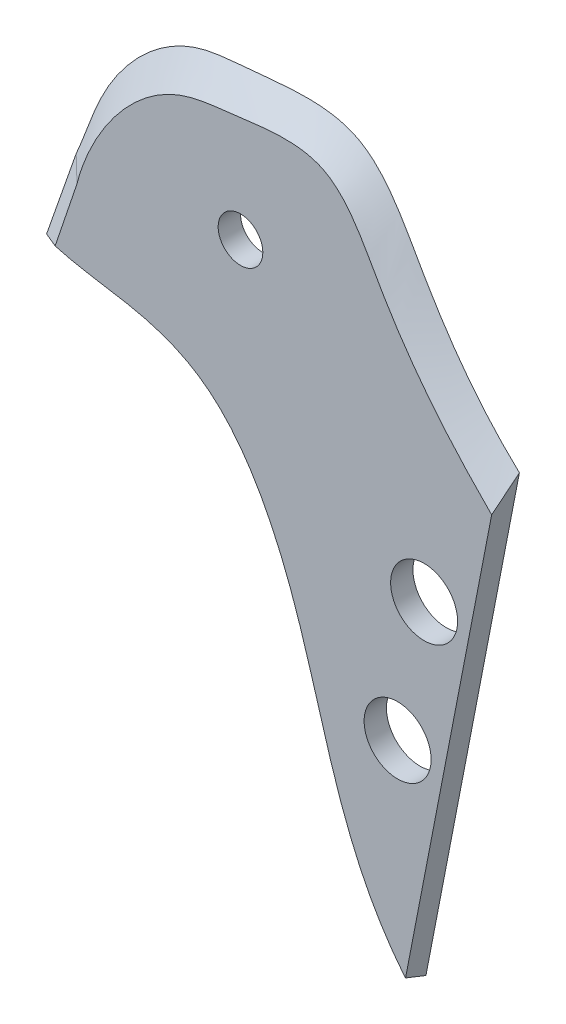
ISO-10303-21;
HEADER;
FILE_DESCRIPTION(('STEP AP214'),'2;1');
FILE_NAME('part.step','',(''),(''),'','','');
FILE_SCHEMA(('AUTOMOTIVE_DESIGN { 1 0 10303 214 1 1 1 1 }'));
ENDSEC;
DATA;
#1=APPLICATION_CONTEXT('core data for automotive mechanical design processes');
#2=APPLICATION_PROTOCOL_DEFINITION('international standard','automotive_design',2000,#1);
#3=PRODUCT_CONTEXT('',#1,'mechanical');
#4=PRODUCT('Part','Part','',(#3));
#5=PRODUCT_RELATED_PRODUCT_CATEGORY('part','',(#4));
#6=PRODUCT_DEFINITION_FORMATION('','',#4);
#7=PRODUCT_DEFINITION_CONTEXT('part definition',#1,'design');
#8=PRODUCT_DEFINITION('design','',#6,#7);
#9=PRODUCT_DEFINITION_SHAPE('','',#8);
#10=(LENGTH_UNIT() NAMED_UNIT(*) SI_UNIT(.MILLI.,.METRE.));
#11=(NAMED_UNIT(*) PLANE_ANGLE_UNIT() SI_UNIT($,.RADIAN.));
#12=(NAMED_UNIT(*) SI_UNIT($,.STERADIAN.) SOLID_ANGLE_UNIT());
#13=UNCERTAINTY_MEASURE_WITH_UNIT(LENGTH_MEASURE(1.E-05),#10,'distance_accuracy_value','');
#14=(GEOMETRIC_REPRESENTATION_CONTEXT(3) GLOBAL_UNCERTAINTY_ASSIGNED_CONTEXT((#13)) GLOBAL_UNIT_ASSIGNED_CONTEXT((#10,
#11,#12)) REPRESENTATION_CONTEXT('',''));
#15=CARTESIAN_POINT('',(0.,0.,0.));
#16=DIRECTION('',(0.,0.,1.));
#17=DIRECTION('',(1.,0.,0.));
#18=AXIS2_PLACEMENT_3D('',#15,#16,#17);
#19=CARTESIAN_POINT('',(0.,0.,16.01702912884));
#20=DIRECTION('',(0.,0.,-1.));
#21=DIRECTION('',(-1.,0.,0.));
#22=AXIS2_PLACEMENT_3D('',#19,#20,#21);
#23=PLANE('',#22);
#24=CARTESIAN_POINT('',(37.1997621715917,16.6182196540824,16.01702912884));
#25=DIRECTION('',(0.,0.,-1.));
#26=DIRECTION('',(-1.,0.,0.));
#27=AXIS2_PLACEMENT_3D('',#24,#25,#26);
#28=CIRCLE('',#27,1.7);
#29=CARTESIAN_POINT('',(35.4997621715917,16.6182196540824,16.01702912884));
#30=VERTEX_POINT('',#29);
#31=EDGE_CURVE('E174',#30,#30,#28,.F.);
#32=ORIENTED_EDGE('',*,*,#31,.T.);
#33=EDGE_LOOP('',(#32));
#34=FACE_BOUND('',#33,.T.);
#35=CARTESIAN_POINT('',(49.1635521652925,-10.4166543376605,16.01702912884));
#36=DIRECTION('',(0.,0.,-1.));
#37=DIRECTION('',(-1.,0.,0.));
#38=AXIS2_PLACEMENT_3D('',#35,#36,#37);
#39=CIRCLE('',#38,2.54999999999999);
#40=CARTESIAN_POINT('',(46.6135521652925,-10.4166543376605,16.01702912884));
#41=VERTEX_POINT('',#40);
#42=EDGE_CURVE('E213',#41,#41,#39,.F.);
#43=ORIENTED_EDGE('',*,*,#42,.T.);
#44=EDGE_LOOP('',(#43));
#45=FACE_BOUND('',#44,.T.);
#46=CARTESIAN_POINT('',(56.7374791845424,10.1611521460587,16.01702912884));
#47=CARTESIAN_POINT('',(53.6201790954461,13.0770034793296,16.01702912884));
#48=CARTESIAN_POINT('',(50.0180932993099,18.1127380968674,16.01702912884));
#49=CARTESIAN_POINT('',(45.1972513004322,27.6593441288069,16.01702912884));
#50=CARTESIAN_POINT('',(37.5823057666446,26.5396477813974,16.01702912884));
#51=CARTESIAN_POINT('',(30.2888783292712,26.1262149818505,16.01702912884));
#52=CARTESIAN_POINT('',(25.1507624600812,20.7991546822461,16.01702912884));
#53=CARTESIAN_POINT('',(23.7062806262853,15.9520347530322,16.01702912884));
#54=CARTESIAN_POINT('',(22.9879280203535,14.3317152162057,16.01702912884));
#55=B_SPLINE_CURVE_WITH_KNOTS('',3,(#46,#47,#48,#49,#50,#51,#52,#53,#54),.UNSPECIFIED.,.F.,.F.,
(4,1,1,1,1,1,4),(0.0984022232735256,0.332263847237948,0.478784406260262,0.635689441844704,
0.712428507943073,0.897170220945366,1.),.UNSPECIFIED.);
#56=CARTESIAN_POINT('',(56.7374791845424,10.1611521460587,16.01702912884));
#57=VERTEX_POINT('',#56);
#58=CARTESIAN_POINT('',(22.9879280203535,14.3317152162057,16.01702912884));
#59=VERTEX_POINT('',#58);
#60=EDGE_CURVE('E11',#57,#59,#55,.T.);
#61=ORIENTED_EDGE('',*,*,#60,.F.);
#62=DIRECTION('',(-0.190360349727867,-0.981714284938079,0.));
#63=VECTOR('',#62,1.);
#64=CARTESIAN_POINT('',(54.4053665233455,-1.86587090183388,16.01702912884));
#65=LINE('',#64,#63);
#66=CARTESIAN_POINT('',(49.6196669779243,-26.5463761324561,16.01702912884));
#67=VERTEX_POINT('',#66);
#68=EDGE_CURVE('E105',#57,#67,#65,.T.);
#69=ORIENTED_EDGE('',*,*,#68,.T.);
#70=CARTESIAN_POINT('',(20.7358239624741,7.90904808817925,16.01702912884));
#71=CARTESIAN_POINT('',(22.1719138725132,7.78885329292571,16.01702912884));
#72=CARTESIAN_POINT('',(25.4971097036187,7.8573029401953,16.01702912884));
#73=CARTESIAN_POINT('',(29.7297821332798,6.63741892427981,16.01702912884));
#74=CARTESIAN_POINT('',(35.1017046824072,5.01907956722342,16.01702912884));
#75=CARTESIAN_POINT('',(42.865459225879,-6.75778599450246,16.01702912884));
#76=CARTESIAN_POINT('',(43.2492805940054,-18.7500409121456,16.01702912884));
#77=CARTESIAN_POINT('',(49.6196669779243,-26.5463761324561,16.01702912884));
#78=B_SPLINE_CURVE_WITH_KNOTS('',3,(#70,#71,#72,#73,#74,#75,#76,#77),.UNSPECIFIED.,.F.,.F.,(4,1,
1,1,1,4),(0.,0.0884615216593502,0.20051623120789,0.26879982875652,0.4246044812526,1.),.UNSPECIFIED.);
#79=CARTESIAN_POINT('',(20.7358239624741,7.90904808817925,16.01702912884));
#80=VERTEX_POINT('',#79);
#81=EDGE_CURVE('E46',#80,#67,#78,.T.);
#82=ORIENTED_EDGE('',*,*,#81,.F.);
#83=DIRECTION('',(-0.330896267797108,-0.943667134088045,0.));
#84=VECTOR('',#83,1.);
#85=CARTESIAN_POINT('',(22.9879280203535,14.3317152162057,16.01702912884));
#86=LINE('',#85,#84);
#87=EDGE_CURVE('E201',#59,#80,#86,.T.);
#88=ORIENTED_EDGE('',*,*,#87,.F.);
#89=EDGE_LOOP('',(#61,#69,#82,#88));
#90=FACE_BOUND('',#89,.T.);
#91=CARTESIAN_POINT('',(51.1823021652925,-0.288224536730692,16.01702912884));
#92=DIRECTION('',(0.,0.,-1.));
#93=DIRECTION('',(-1.,0.,0.));
#94=AXIS2_PLACEMENT_3D('',#91,#92,#93);
#95=CIRCLE('',#94,2.55);
#96=CARTESIAN_POINT('',(48.6323021652925,-0.288224536730692,16.01702912884));
#97=VERTEX_POINT('',#96);
#98=EDGE_CURVE('E272',#97,#97,#95,.F.);
#99=ORIENTED_EDGE('',*,*,#98,.T.);
#100=EDGE_LOOP('',(#99));
#101=FACE_BOUND('',#100,.T.);
#102=ADVANCED_FACE('F37',(#34,#45,#90,#101),#23,.T.);
#103=CARTESIAN_POINT('',(56.7374791845424,10.1611521460587,16.01702912884));
#104=CARTESIAN_POINT('',(56.3247621715917,8.03271422382369,17.71702912884));
#105=CARTESIAN_POINT('',(53.6201790954461,13.0770034793296,16.01702912884));
#106=CARTESIAN_POINT('',(53.4815340141107,10.8813682024356,17.71702912884));
#107=CARTESIAN_POINT('',(50.9276386605399,16.8411889664497,16.01702912884));
#108=CARTESIAN_POINT('',(50.6303744477103,14.1981402639373,17.71702912884));
#109=CARTESIAN_POINT('',(47.4668919484403,23.1648253070632,16.01702912884));
#110=CARTESIAN_POINT('',(47.2667425586454,19.7150457705081,17.71702912884));
#111=CARTESIAN_POINT('',(45.4662591057677,25.8150722220901,16.01702912884));
#112=CARTESIAN_POINT('',(45.7145385390748,22.7407509049763,17.71702912884));
#113=CARTESIAN_POINT('',(41.4908067982299,27.1143510815713,16.01702912884));
#114=CARTESIAN_POINT('',(42.6933411886686,25.2368619241954,17.71702912884));
#115=CARTESIAN_POINT('',(37.9577758668488,26.6416571868208,16.01702912884));
#116=CARTESIAN_POINT('',(39.4587516791819,24.9632796151015,17.71702912884));
#117=CARTESIAN_POINT('',(34.4403844972373,26.3615458783455,16.01702912884));
#118=CARTESIAN_POINT('',(36.052554326043,24.5184502229449,17.71702912884));
#119=CARTESIAN_POINT('',(32.7201382629059,26.1402152904171,16.01702912884));
#120=CARTESIAN_POINT('',(34.3900462403712,24.3501831932131,17.71702912884));
#121=CARTESIAN_POINT('',(28.8729837341728,24.6582535582475,16.01702912884));
#122=CARTESIAN_POINT('',(30.6843016318662,23.4039560479854,17.71702912884));
#123=CARTESIAN_POINT('',(25.0319533013774,20.400477296728,16.01702912884));
#124=CARTESIAN_POINT('',(26.9291205566539,19.7912997497251,17.71702912884));
#125=CARTESIAN_POINT('',(23.7062806262853,15.9520347530322,16.01702912884));
#126=CARTESIAN_POINT('',(25.1314869237919,15.6032090618174,17.71702912884));
#127=CARTESIAN_POINT('',(22.9879280203535,14.3317152162057,16.01702912884));
#128=CARTESIAN_POINT('',(24.7497084623282,14.0682196540823,17.71702912884));
#129=B_SPLINE_SURFACE_WITH_KNOTS('',3,1,((#103,#104),(#105,#106),(#107,#108),(#109,#110),(#111,
#112),(#113,#114),(#115,#116),(#117,#118),(#119,#120),(#121,#122),(#123,#124),(#125,#126),(#127,
#128)),.UNSPECIFIED.,.F.,.F.,.F.,(4,1,1,1,1,1,1,1,1,1,4),(2,2),(0.,0.259385759372132,
0.315366468989364,0.421897871540711,0.46461990204709,0.595927843258402,0.621804756140367,
0.681042367805029,0.707276749613521,0.88594716878297,1.),(0.,1.),.UNSPECIFIED.);
#130=DIRECTION('',(0.715479586900087,-0.107008621191608,0.69038982880685));
#131=VECTOR('',#130,1.);
#132=CARTESIAN_POINT('',(23.8688182413409,14.199967435144,16.86702912884));
#133=LINE('',#132,#131);
#134=CARTESIAN_POINT('',(24.7497084623282,14.0682196540823,17.71702912884));
#135=VERTEX_POINT('',#134);
#136=EDGE_CURVE('E98',#59,#135,#133,.T.);
#137=CARTESIAN_POINT('',(56.3247621715917,8.03271422382369,17.71702912884));
#138=CARTESIAN_POINT('',(52.8679076907351,11.496165528097,17.71702912884));
#139=CARTESIAN_POINT('',(48.8599680154124,16.3360273622185,17.71702912884));
#140=CARTESIAN_POINT('',(44.2241470254929,25.775486125325,17.71702912884));
#141=CARTESIAN_POINT('',(37.567466531524,24.6409319402532,17.71702912884));
#142=CARTESIAN_POINT('',(29.7072493366158,23.9216854788249,17.71702912884));
#143=CARTESIAN_POINT('',(25.7295651741228,18.0078595906483,17.71702912884));
#144=CARTESIAN_POINT('',(24.7497084623282,14.0682196540823,17.71702912884));
#145=B_SPLINE_CURVE_WITH_KNOTS('',3,(#137,#138,#139,#140,#141,#142,#143,#144),.UNSPECIFIED.,.F.,
.F.,(4,1,1,1,1,4),(0.,0.315366468989364,0.46461990204709,0.621804756140367,0.707276749613521,
1.),.UNSPECIFIED.);
#146=CARTESIAN_POINT('',(56.3247621715917,8.03271422382369,17.71702912884));
#147=VERTEX_POINT('',#146);
#148=EDGE_CURVE('E81',#147,#135,#145,.T.);
#149=DIRECTION('',(0.149801028702046,0.772544334917706,-0.617037196922818));
#150=VECTOR('',#149,1.);
#151=CARTESIAN_POINT('',(56.5311206780671,9.09693318494118,16.86702912884));
#152=LINE('',#151,#150);
#153=EDGE_CURVE('E96',#147,#57,#152,.T.);
#154=ORIENTED_EDGE('',*,*,#60,.T.);
#155=ORIENTED_EDGE('',*,*,#136,.T.);
#156=ORIENTED_EDGE('',*,*,#148,.F.);
#157=ORIENTED_EDGE('',*,*,#153,.T.);
#158=EDGE_LOOP('',(#154,#155,#156,#157));
#159=FACE_BOUND('',#158,.T.);
#160=ADVANCED_FACE('F95',(#159),#129,.T.);
#161=CARTESIAN_POINT('',(22.9879280203535,14.3317152162057,16.01702912884));
#162=CARTESIAN_POINT('',(24.7497084623282,14.0682196540823,17.71702912884));
#163=CARTESIAN_POINT('',(22.6125773440403,13.261270694868,16.01702912884));
#164=CARTESIAN_POINT('',(24.4726287269215,13.2476373607624,17.71702912884));
#165=CARTESIAN_POINT('',(22.2372266677271,12.1908261735302,16.01702912884));
#166=CARTESIAN_POINT('',(24.1955489915148,12.4270550674425,17.71702912884));
#167=CARTESIAN_POINT('',(21.4865253151006,10.0499371308547,16.01702912884));
#168=CARTESIAN_POINT('',(23.6413895207013,10.7858904808026,17.71702912884));
#169=CARTESIAN_POINT('',(21.1111746387874,8.97949260951699,16.01702912884));
#170=CARTESIAN_POINT('',(23.3643097852946,9.96530818748272,17.71702912884));
#171=CARTESIAN_POINT('',(20.7358239624741,7.90904808817925,16.01702912884));
#172=CARTESIAN_POINT('',(23.0872300498878,9.14472589416278,17.71702912884));
#173=B_SPLINE_SURFACE_WITH_KNOTS('',3,1,((#161,#162),(#163,#164),(#165,#166),(#167,#168),(#169,
#170),(#171,#172)),.UNSPECIFIED.,.F.,.F.,.F.,(4,2,4),(2,2),(0.,0.5,1.),(0.,1.),.UNSPECIFIED.);
#174=DIRECTION('',(0.745595344172381,0.391814763077272,0.539044315602316));
#175=VECTOR('',#174,1.);
#176=CARTESIAN_POINT('',(21.911527006181,8.52688699117102,16.86702912884));
#177=LINE('',#176,#175);
#178=CARTESIAN_POINT('',(23.0872300498878,9.14472589416278,17.71702912884));
#179=VERTEX_POINT('',#178);
#180=EDGE_CURVE('E111',#80,#179,#177,.T.);
#181=DIRECTION('',(-0.319916718913096,-0.947445667550324,0.));
#182=VECTOR('',#181,1.);
#183=CARTESIAN_POINT('',(24.7497084623282,14.0682196540823,17.71702912884));
#184=LINE('',#183,#182);
#185=EDGE_CURVE('E170',#135,#179,#184,.T.);
#186=ORIENTED_EDGE('',*,*,#87,.T.);
#187=ORIENTED_EDGE('',*,*,#180,.T.);
#188=ORIENTED_EDGE('',*,*,#185,.F.);
#189=ORIENTED_EDGE('',*,*,#136,.F.);
#190=EDGE_LOOP('',(#186,#187,#188,#189));
#191=FACE_BOUND('',#190,.T.);
#192=ADVANCED_FACE('F139',(#191),#173,.T.);
#193=CARTESIAN_POINT('',(42.2011849808601,24.8148172093596,17.71702912884));
#194=DIRECTION('',(0.,0.,1.));
#195=DIRECTION('',(1.,0.,0.));
#196=AXIS2_PLACEMENT_3D('',#193,#194,#195);
#197=PLANE('',#196);
#198=CARTESIAN_POINT('',(49.1635521652925,-10.4166543376605,17.71702912884));
#199=DIRECTION('',(0.,0.,1.));
#200=DIRECTION('',(1.,0.,0.));
#201=AXIS2_PLACEMENT_3D('',#198,#199,#200);
#202=CIRCLE('',#201,2.54999999999999);
#203=CARTESIAN_POINT('',(51.7135521652925,-10.4166543376605,17.71702912884));
#204=VERTEX_POINT('',#203);
#205=EDGE_CURVE('E265',#204,#204,#202,.T.);
#206=ORIENTED_EDGE('',*,*,#205,.F.);
#207=EDGE_LOOP('',(#206));
#208=FACE_BOUND('',#207,.T.);
#209=CARTESIAN_POINT('',(51.1823021652925,-0.288224536730692,17.71702912884));
#210=DIRECTION('',(0.,0.,1.));
#211=DIRECTION('',(1.,0.,0.));
#212=AXIS2_PLACEMENT_3D('',#209,#210,#211);
#213=CIRCLE('',#212,2.55);
#214=CARTESIAN_POINT('',(53.7323021652925,-0.288224536730692,17.71702912884));
#215=VERTEX_POINT('',#214);
#216=EDGE_CURVE('E109',#215,#215,#213,.T.);
#217=ORIENTED_EDGE('',*,*,#216,.F.);
#218=EDGE_LOOP('',(#217));
#219=FACE_BOUND('',#218,.T.);
#220=CARTESIAN_POINT('',(37.1997621715917,16.6182196540824,17.71702912884));
#221=DIRECTION('',(0.,0.,1.));
#222=DIRECTION('',(1.,0.,0.));
#223=AXIS2_PLACEMENT_3D('',#220,#221,#222);
#224=CIRCLE('',#223,1.7);
#225=CARTESIAN_POINT('',(38.8997621715917,16.6182196540824,17.71702912884));
#226=VERTEX_POINT('',#225);
#227=EDGE_CURVE('E106',#226,#226,#224,.T.);
#228=ORIENTED_EDGE('',*,*,#227,.F.);
#229=EDGE_LOOP('',(#228));
#230=FACE_BOUND('',#229,.T.);
#231=ORIENTED_EDGE('',*,*,#148,.T.);
#232=ORIENTED_EDGE('',*,*,#185,.T.);
#233=CARTESIAN_POINT('',(23.0872300498878,9.14472589416278,17.71702912884));
#234=CARTESIAN_POINT('',(23.9071552614502,8.90389135487674,17.71702912884));
#235=CARTESIAN_POINT('',(26.4147155565695,8.40600553783021,17.71702912884));
#236=CARTESIAN_POINT('',(30.1574904202226,7.93532093414824,17.71702912884));
#237=CARTESIAN_POINT('',(35.409397744306,5.68865065157843,17.71702912884));
#238=CARTESIAN_POINT('',(43.4811194703326,-5.64116995348703,17.71702912884));
#239=CARTESIAN_POINT('',(43.5281504977051,-18.220731086188,17.71702912884));
#240=CARTESIAN_POINT('',(49.7666771672669,-25.7882245367307,17.71702912884));
#241=B_SPLINE_CURVE_WITH_KNOTS('',3,(#233,#234,#235,#236,#237,#238,#239,#240),.UNSPECIFIED.,.F.,
.F.,(4,1,1,1,1,4),(0.,0.0541824296374315,0.16221333097239,0.238719582243554,0.409718141961211,
1.),.UNSPECIFIED.);
#242=CARTESIAN_POINT('',(49.7666771672669,-25.7882245367307,17.71702912884));
#243=VERTEX_POINT('',#242);
#244=EDGE_CURVE('E84',#179,#243,#241,.T.);
#245=ORIENTED_EDGE('',*,*,#244,.T.);
#246=DIRECTION('',(0.190360349727867,0.981714284938079,0.));
#247=VECTOR('',#246,1.);
#248=CARTESIAN_POINT('',(49.7666771672668,-25.7882245367307,17.71702912884));
#249=LINE('',#248,#247);
#250=EDGE_CURVE('E77',#243,#147,#249,.T.);
#251=ORIENTED_EDGE('',*,*,#250,.T.);
#252=EDGE_LOOP('',(#231,#232,#245,#251));
#253=FACE_BOUND('',#252,.T.);
#254=ADVANCED_FACE('F80',(#208,#219,#230,#253),#197,.T.);
#255=CARTESIAN_POINT('',(54.4053665233455,-1.86587090183388,9.68452912884005));
#256=DIRECTION('',(-0.981714284938079,0.190360349727867,0.));
#257=DIRECTION('',(-0.190360349727867,-0.981714284938079,0.));
#258=AXIS2_PLACEMENT_3D('',#255,#256,#257);
#259=PLANE('',#258);
#260=ORIENTED_EDGE('',*,*,#68,.F.);
#261=ORIENTED_EDGE('',*,*,#153,.F.);
#262=ORIENTED_EDGE('',*,*,#250,.F.);
#263=DIRECTION('',(0.0787333022099367,0.40603837716383,0.910458073385745));
#264=VECTOR('',#263,1.);
#265=CARTESIAN_POINT('',(49.6931720725956,-26.1673003345934,16.86702912884));
#266=LINE('',#265,#264);
#267=EDGE_CURVE('E100',#67,#243,#266,.T.);
#268=ORIENTED_EDGE('',*,*,#267,.F.);
#269=EDGE_LOOP('',(#260,#261,#262,#268));
#270=FACE_BOUND('',#269,.T.);
#271=ADVANCED_FACE('F104',(#270),#259,.F.);
#272=CARTESIAN_POINT('',(20.7358239624741,7.90904808817925,16.01702912884));
#273=CARTESIAN_POINT('',(23.0872300498878,9.14472589416278,17.71702912884));
#274=CARTESIAN_POINT('',(21.6154249352378,7.83542911899976,16.01702912884));
#275=CARTESIAN_POINT('',(23.9071552614502,8.90389135487674,17.71702912884));
#276=CARTESIAN_POINT('',(23.0704306063669,7.80734939259081,16.01702912884));
#277=CARTESIAN_POINT('',(25.2746297965522,8.63237398497549,17.71702912884));
#278=CARTESIAN_POINT('',(25.7237718116332,7.64883772411055,16.01702912884));
#279=CARTESIAN_POINT('',(27.8016631900876,8.23158550964478,17.71702912884));
#280=CARTESIAN_POINT('',(28.0514115307685,7.1211363639849,16.01702912884));
#281=CARTESIAN_POINT('',(30.0713165943711,7.82488479816171,17.71702912884));
#282=CARTESIAN_POINT('',(30.4318693935687,6.42225490504846,16.01702912884));
#283=CARTESIAN_POINT('',(32.3191060824179,7.01062113064603,17.71702912884));
#284=CARTESIAN_POINT('',(32.1310659942215,5.91401084382313,16.01702912884));
#285=CARTESIAN_POINT('',(33.808843698735,6.21825298874981,17.71702912884));
#286=CARTESIAN_POINT('',(35.2507090670857,4.55315707015074,16.01702912884));
#287=CARTESIAN_POINT('',(36.4363137620361,4.24722654749472,17.71702912884));
#288=CARTESIAN_POINT('',(37.1332559765229,1.93741252860381,16.01702912884));
#289=CARTESIAN_POINT('',(38.1569260374253,1.71136973947847,17.71702912884));
#290=CARTESIAN_POINT('',(42.939430023337,-9.06895658906215,16.01702912884));
#291=CARTESIAN_POINT('',(43.4926032252927,-8.71277194953148,17.71702912884));
#292=CARTESIAN_POINT('',(43.2492805940054,-18.7500409121456,16.01702912884));
#293=CARTESIAN_POINT('',(43.6854801249277,-18.4115759741953,17.71702912884));
#294=CARTESIAN_POINT('',(49.6196669779243,-26.5463761324561,16.01702912884));
#295=CARTESIAN_POINT('',(49.7666771672669,-25.7882245367307,17.71702912884));
#296=B_SPLINE_SURFACE_WITH_KNOTS('',3,1,((#272,#273),(#274,#275),(#276,#277),(#278,#279),(#280,
#281),(#282,#283),(#284,#285),(#286,#287),(#288,#289),(#290,#291),(#292,#293),(#294,#295)),
.UNSPECIFIED.,.F.,.F.,.F.,(4,1,1,1,1,1,1,1,1,4),(2,2),(0.,0.0541824296374315,0.0884615216593502,
0.16221333097239,0.20051623120789,0.238719582243554,0.26879982875652,0.409718141961211,
0.4246044812526,1.),(0.,1.),.UNSPECIFIED.);
#297=ORIENTED_EDGE('',*,*,#81,.T.);
#298=ORIENTED_EDGE('',*,*,#267,.T.);
#299=ORIENTED_EDGE('',*,*,#244,.F.);
#300=ORIENTED_EDGE('',*,*,#180,.F.);
#301=EDGE_LOOP('',(#297,#298,#299,#300));
#302=FACE_BOUND('',#301,.T.);
#303=ADVANCED_FACE('F125',(#302),#296,.T.);
#304=CARTESIAN_POINT('',(49.1635521652925,-10.4166543376605,4.55453996073728));
#305=DIRECTION('',(0.,0.,1.));
#306=DIRECTION('',(1.,0.,0.));
#307=AXIS2_PLACEMENT_3D('',#304,#305,#306);
#308=CYLINDRICAL_SURFACE('',#307,2.54999999999999);
#309=ORIENTED_EDGE('',*,*,#205,.T.);
#310=EDGE_LOOP('',(#309));
#311=FACE_BOUND('',#310,.T.);
#312=ORIENTED_EDGE('',*,*,#42,.F.);
#313=EDGE_LOOP('',(#312));
#314=FACE_BOUND('',#313,.T.);
#315=ADVANCED_FACE('F39',(#311,#314),#308,.F.);
#316=CARTESIAN_POINT('',(51.1823021652925,-0.288224536730692,4.55453996073724));
#317=DIRECTION('',(0.,0.,1.));
#318=DIRECTION('',(1.,0.,0.));
#319=AXIS2_PLACEMENT_3D('',#316,#317,#318);
#320=CYLINDRICAL_SURFACE('',#319,2.55);
#321=ORIENTED_EDGE('',*,*,#216,.T.);
#322=EDGE_LOOP('',(#321));
#323=FACE_BOUND('',#322,.T.);
#324=ORIENTED_EDGE('',*,*,#98,.F.);
#325=EDGE_LOOP('',(#324));
#326=FACE_BOUND('',#325,.T.);
#327=ADVANCED_FACE('F242',(#323,#326),#320,.F.);
#328=CARTESIAN_POINT('',(37.1997621715917,16.6182196540824,15.59202912884));
#329=DIRECTION('',(0.,0.,1.));
#330=DIRECTION('',(1.,0.,0.));
#331=AXIS2_PLACEMENT_3D('',#328,#329,#330);
#332=CYLINDRICAL_SURFACE('',#331,1.7);
#333=ORIENTED_EDGE('',*,*,#227,.T.);
#334=EDGE_LOOP('',(#333));
#335=FACE_BOUND('',#334,.T.);
#336=ORIENTED_EDGE('',*,*,#31,.F.);
#337=EDGE_LOOP('',(#336));
#338=FACE_BOUND('',#337,.T.);
#339=ADVANCED_FACE('F227',(#335,#338),#332,.F.);
#340=CLOSED_SHELL('',(#102,#160,#192,#254,#271,#303,#315,#327,#339));
#341=MANIFOLD_SOLID_BREP('B2',#340);
#342=ADVANCED_BREP_SHAPE_REPRESENTATION('',(#18,#341),#14);
#343=SHAPE_DEFINITION_REPRESENTATION(#9,#342);
ENDSEC;
END-ISO-10303-21;
